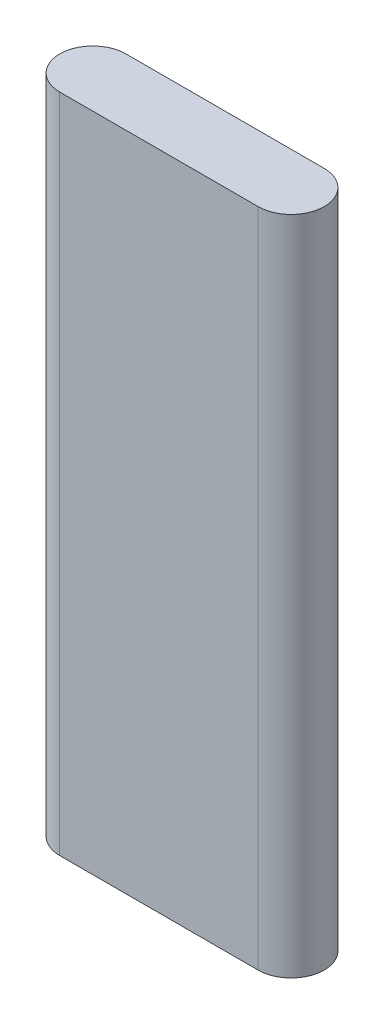
ISO-10303-21;
HEADER;
FILE_DESCRIPTION(('STEP AP214'),'2;1');
FILE_NAME('part.step','',(''),(''),'','','');
FILE_SCHEMA(('AUTOMOTIVE_DESIGN { 1 0 10303 214 1 1 1 1 }'));
ENDSEC;
DATA;
#1=APPLICATION_CONTEXT('core data for automotive mechanical design processes');
#2=APPLICATION_PROTOCOL_DEFINITION('international standard','automotive_design',2000,#1);
#3=PRODUCT_CONTEXT('',#1,'mechanical');
#4=PRODUCT('Part','Part','',(#3));
#5=PRODUCT_RELATED_PRODUCT_CATEGORY('part','',(#4));
#6=PRODUCT_DEFINITION_FORMATION('','',#4);
#7=PRODUCT_DEFINITION_CONTEXT('part definition',#1,'design');
#8=PRODUCT_DEFINITION('design','',#6,#7);
#9=PRODUCT_DEFINITION_SHAPE('','',#8);
#10=(LENGTH_UNIT() NAMED_UNIT(*) SI_UNIT(.MILLI.,.METRE.));
#11=(NAMED_UNIT(*) PLANE_ANGLE_UNIT() SI_UNIT($,.RADIAN.));
#12=(NAMED_UNIT(*) SI_UNIT($,.STERADIAN.) SOLID_ANGLE_UNIT());
#13=UNCERTAINTY_MEASURE_WITH_UNIT(LENGTH_MEASURE(1.E-05),#10,'distance_accuracy_value','');
#14=(GEOMETRIC_REPRESENTATION_CONTEXT(3) GLOBAL_UNCERTAINTY_ASSIGNED_CONTEXT((#13)) GLOBAL_UNIT_ASSIGNED_CONTEXT((#10,
#11,#12)) REPRESENTATION_CONTEXT('',''));
#15=CARTESIAN_POINT('',(0.,0.,0.));
#16=DIRECTION('',(0.,0.,1.));
#17=DIRECTION('',(1.,0.,0.));
#18=AXIS2_PLACEMENT_3D('',#15,#16,#17);
#19=CARTESIAN_POINT('',(0.,100.,5.));
#20=DIRECTION('',(0.,0.,-1.));
#21=DIRECTION('',(-1.,0.,0.));
#22=AXIS2_PLACEMENT_3D('',#19,#20,#21);
#23=PLANE('',#22);
#24=DIRECTION('',(1.,0.,0.));
#25=VECTOR('',#24,1.);
#26=CARTESIAN_POINT('',(0.,0.,5.));
#27=LINE('',#26,#25);
#28=CARTESIAN_POINT('',(-15.,0.,5.));
#29=VERTEX_POINT('',#28);
#30=CARTESIAN_POINT('',(15.,0.,5.));
#31=VERTEX_POINT('',#30);
#32=EDGE_CURVE('E97',#29,#31,#27,.T.);
#33=ORIENTED_EDGE('',*,*,#32,.T.);
#34=DIRECTION('',(0.,-1.,0.));
#35=VECTOR('',#34,1.);
#36=CARTESIAN_POINT('',(15.,100.,5.));
#37=LINE('',#36,#35);
#38=CARTESIAN_POINT('',(15.,100.,5.));
#39=VERTEX_POINT('',#38);
#40=EDGE_CURVE('E11',#39,#31,#37,.T.);
#41=ORIENTED_EDGE('',*,*,#40,.F.);
#42=DIRECTION('',(1.,0.,0.));
#43=VECTOR('',#42,1.);
#44=CARTESIAN_POINT('',(0.,100.,5.));
#45=LINE('',#44,#43);
#46=CARTESIAN_POINT('',(-15.,100.,5.));
#47=VERTEX_POINT('',#46);
#48=EDGE_CURVE('E82',#47,#39,#45,.T.);
#49=ORIENTED_EDGE('',*,*,#48,.F.);
#50=DIRECTION('',(0.,-1.,0.));
#51=VECTOR('',#50,1.);
#52=CARTESIAN_POINT('',(-15.,100.,5.));
#53=LINE('',#52,#51);
#54=EDGE_CURVE('E93',#47,#29,#53,.T.);
#55=ORIENTED_EDGE('',*,*,#54,.T.);
#56=EDGE_LOOP('',(#33,#41,#49,#55));
#57=FACE_BOUND('',#56,.T.);
#58=ADVANCED_FACE('F35',(#57),#23,.F.);
#59=CARTESIAN_POINT('',(15.,100.,0.));
#60=DIRECTION('',(0.,-1.,0.));
#61=DIRECTION('',(0.,0.,-1.));
#62=AXIS2_PLACEMENT_3D('',#59,#60,#61);
#63=CYLINDRICAL_SURFACE('',#62,5.);
#64=CARTESIAN_POINT('',(15.,0.,0.));
#65=DIRECTION('',(0.,1.,0.));
#66=DIRECTION('',(0.,0.,1.));
#67=AXIS2_PLACEMENT_3D('',#64,#65,#66);
#68=CIRCLE('',#67,5.);
#69=CARTESIAN_POINT('',(15.,0.,-5.));
#70=VERTEX_POINT('',#69);
#71=EDGE_CURVE('E87',#31,#70,#68,.T.);
#72=ORIENTED_EDGE('',*,*,#71,.T.);
#73=DIRECTION('',(0.,-1.,0.));
#74=VECTOR('',#73,1.);
#75=CARTESIAN_POINT('',(15.,100.,-5.));
#76=LINE('',#75,#74);
#77=CARTESIAN_POINT('',(15.,100.,-5.));
#78=VERTEX_POINT('',#77);
#79=EDGE_CURVE('E43',#78,#70,#76,.T.);
#80=ORIENTED_EDGE('',*,*,#79,.F.);
#81=CARTESIAN_POINT('',(15.,100.,0.));
#82=DIRECTION('',(0.,1.,0.));
#83=DIRECTION('',(0.,0.,1.));
#84=AXIS2_PLACEMENT_3D('',#81,#82,#83);
#85=CIRCLE('',#84,5.);
#86=EDGE_CURVE('E77',#39,#78,#85,.T.);
#87=ORIENTED_EDGE('',*,*,#86,.F.);
#88=ORIENTED_EDGE('',*,*,#40,.T.);
#89=EDGE_LOOP('',(#72,#80,#87,#88));
#90=FACE_BOUND('',#89,.T.);
#91=ADVANCED_FACE('F86',(#90),#63,.T.);
#92=CARTESIAN_POINT('',(0.,100.,-5.));
#93=DIRECTION('',(0.,0.,-1.));
#94=DIRECTION('',(-1.,0.,0.));
#95=AXIS2_PLACEMENT_3D('',#92,#93,#94);
#96=PLANE('',#95);
#97=DIRECTION('',(1.,0.,0.));
#98=VECTOR('',#97,1.);
#99=CARTESIAN_POINT('',(0.,0.,-5.));
#100=LINE('',#99,#98);
#101=CARTESIAN_POINT('',(-15.,0.,-5.));
#102=VERTEX_POINT('',#101);
#103=EDGE_CURVE('E102',#102,#70,#100,.T.);
#104=ORIENTED_EDGE('',*,*,#103,.F.);
#105=DIRECTION('',(0.,-1.,0.));
#106=VECTOR('',#105,1.);
#107=CARTESIAN_POINT('',(-15.,100.,-5.));
#108=LINE('',#107,#106);
#109=CARTESIAN_POINT('',(-15.,100.,-5.));
#110=VERTEX_POINT('',#109);
#111=EDGE_CURVE('E67',#110,#102,#108,.T.);
#112=ORIENTED_EDGE('',*,*,#111,.F.);
#113=DIRECTION('',(1.,0.,0.));
#114=VECTOR('',#113,1.);
#115=CARTESIAN_POINT('',(0.,100.,-5.));
#116=LINE('',#115,#114);
#117=EDGE_CURVE('E80',#110,#78,#116,.T.);
#118=ORIENTED_EDGE('',*,*,#117,.T.);
#119=ORIENTED_EDGE('',*,*,#79,.T.);
#120=EDGE_LOOP('',(#104,#112,#118,#119));
#121=FACE_BOUND('',#120,.T.);
#122=ADVANCED_FACE('F91',(#121),#96,.T.);
#123=CARTESIAN_POINT('',(-15.,100.,0.));
#124=DIRECTION('',(0.,-1.,0.));
#125=DIRECTION('',(0.,0.,-1.));
#126=AXIS2_PLACEMENT_3D('',#123,#124,#125);
#127=CYLINDRICAL_SURFACE('',#126,5.);
#128=CARTESIAN_POINT('',(-15.,0.,0.));
#129=DIRECTION('',(0.,1.,0.));
#130=DIRECTION('',(0.,0.,1.));
#131=AXIS2_PLACEMENT_3D('',#128,#129,#130);
#132=CIRCLE('',#131,5.);
#133=EDGE_CURVE('E70',#102,#29,#132,.T.);
#134=ORIENTED_EDGE('',*,*,#133,.T.);
#135=ORIENTED_EDGE('',*,*,#54,.F.);
#136=CARTESIAN_POINT('',(-15.,100.,0.));
#137=DIRECTION('',(0.,1.,0.));
#138=DIRECTION('',(0.,0.,1.));
#139=AXIS2_PLACEMENT_3D('',#136,#137,#138);
#140=CIRCLE('',#139,5.);
#141=EDGE_CURVE('E51',#110,#47,#140,.T.);
#142=ORIENTED_EDGE('',*,*,#141,.F.);
#143=ORIENTED_EDGE('',*,*,#111,.T.);
#144=EDGE_LOOP('',(#134,#135,#142,#143));
#145=FACE_BOUND('',#144,.T.);
#146=ADVANCED_FACE('F121',(#145),#127,.T.);
#147=CARTESIAN_POINT('',(0.,100.,0.));
#148=DIRECTION('',(0.,1.,0.));
#149=DIRECTION('',(0.,0.,1.));
#150=AXIS2_PLACEMENT_3D('',#147,#148,#149);
#151=PLANE('',#150);
#152=ORIENTED_EDGE('',*,*,#48,.T.);
#153=ORIENTED_EDGE('',*,*,#86,.T.);
#154=ORIENTED_EDGE('',*,*,#117,.F.);
#155=ORIENTED_EDGE('',*,*,#141,.T.);
#156=EDGE_LOOP('',(#152,#153,#154,#155));
#157=FACE_BOUND('',#156,.T.);
#158=ADVANCED_FACE('F78',(#157),#151,.T.);
#159=CARTESIAN_POINT('',(0.,0.,0.));
#160=DIRECTION('',(0.,1.,0.));
#161=DIRECTION('',(0.,0.,1.));
#162=AXIS2_PLACEMENT_3D('',#159,#160,#161);
#163=PLANE('',#162);
#164=CARTESIAN_POINT('',(0.,0.,0.));
#165=DIRECTION('',(0.,-1.,0.));
#166=DIRECTION('',(0.,0.,-1.));
#167=AXIS2_PLACEMENT_3D('',#164,#165,#166);
#168=CIRCLE('',#167,2.55);
#169=CARTESIAN_POINT('',(0.,0.,-2.55));
#170=VERTEX_POINT('',#169);
#171=EDGE_CURVE('E173',#170,#170,#168,.T.);
#172=ORIENTED_EDGE('',*,*,#171,.F.);
#173=EDGE_LOOP('',(#172));
#174=FACE_BOUND('',#173,.T.);
#175=ORIENTED_EDGE('',*,*,#32,.F.);
#176=ORIENTED_EDGE('',*,*,#133,.F.);
#177=ORIENTED_EDGE('',*,*,#103,.T.);
#178=ORIENTED_EDGE('',*,*,#71,.F.);
#179=EDGE_LOOP('',(#175,#176,#177,#178));
#180=FACE_BOUND('',#179,.T.);
#181=ADVANCED_FACE('F109',(#174,#180),#163,.F.);
#182=CARTESIAN_POINT('',(0.,30.,0.));
#183=DIRECTION('',(0.,-1.,0.));
#184=DIRECTION('',(0.,0.,-1.));
#185=AXIS2_PLACEMENT_3D('',#182,#183,#184);
#186=CYLINDRICAL_SURFACE('',#185,2.55);
#187=CARTESIAN_POINT('',(0.,30.,0.));
#188=DIRECTION('',(0.,-1.,0.));
#189=DIRECTION('',(0.,0.,-1.));
#190=AXIS2_PLACEMENT_3D('',#187,#188,#189);
#191=CIRCLE('',#190,2.55);
#192=CARTESIAN_POINT('',(0.,30.,-2.55));
#193=VERTEX_POINT('',#192);
#194=EDGE_CURVE('E100',#193,#193,#191,.T.);
#195=ORIENTED_EDGE('',*,*,#194,.F.);
#196=EDGE_LOOP('',(#195));
#197=FACE_BOUND('',#196,.T.);
#198=ORIENTED_EDGE('',*,*,#171,.T.);
#199=EDGE_LOOP('',(#198));
#200=FACE_BOUND('',#199,.T.);
#201=ADVANCED_FACE('F111',(#197,#200),#186,.F.);
#202=CARTESIAN_POINT('',(0.,30.,0.));
#203=DIRECTION('',(0.,-1.,0.));
#204=DIRECTION('',(0.,0.,-1.));
#205=AXIS2_PLACEMENT_3D('',#202,#203,#204);
#206=PLANE('',#205);
#207=ORIENTED_EDGE('',*,*,#194,.T.);
#208=EDGE_LOOP('',(#207));
#209=FACE_BOUND('',#208,.T.);
#210=ADVANCED_FACE('F118',(#209),#206,.T.);
#211=CLOSED_SHELL('',(#58,#91,#122,#146,#158,#181,#201,#210));
#212=MANIFOLD_SOLID_BREP('B2',#211);
#213=ADVANCED_BREP_SHAPE_REPRESENTATION('',(#18,#212),#14);
#214=SHAPE_DEFINITION_REPRESENTATION(#9,#213);
ENDSEC;
END-ISO-10303-21;
